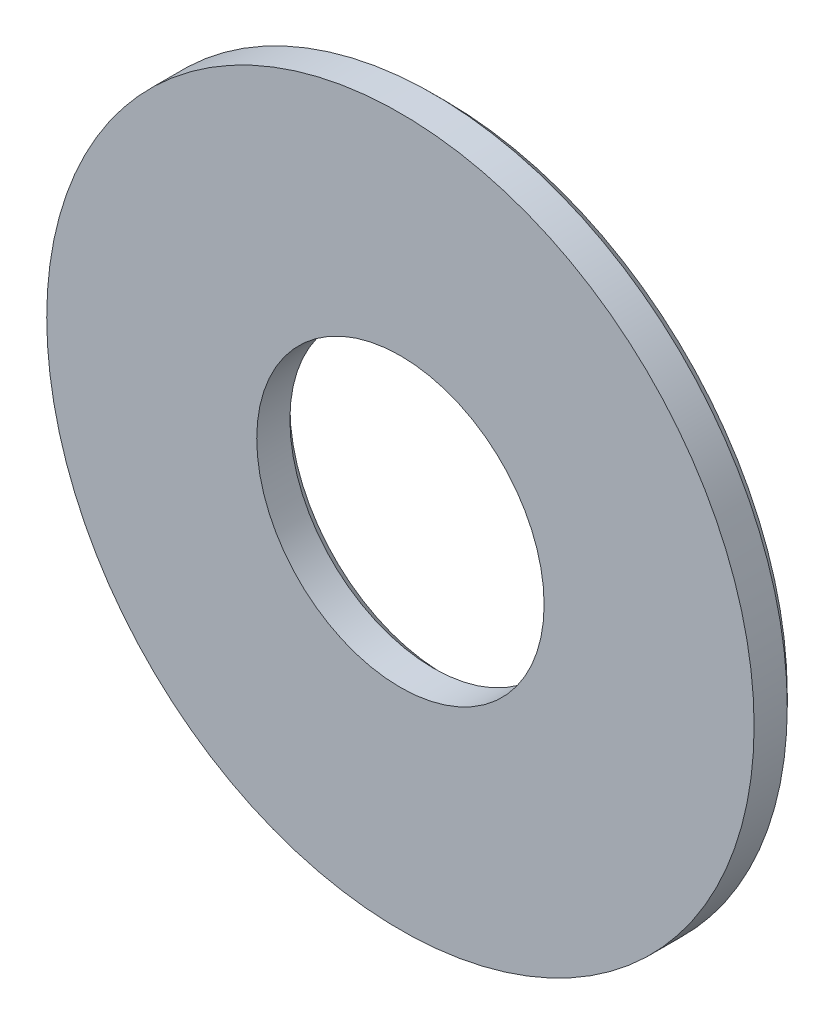
ISO-10303-21;
HEADER;
FILE_DESCRIPTION(('STEP AP214'),'2;1');
FILE_NAME('part.step','',(''),(''),'','','');
FILE_SCHEMA(('AUTOMOTIVE_DESIGN { 1 0 10303 214 1 1 1 1 }'));
ENDSEC;
DATA;
#1=APPLICATION_CONTEXT('core data for automotive mechanical design processes');
#2=APPLICATION_PROTOCOL_DEFINITION('international standard','automotive_design',2000,#1);
#3=PRODUCT_CONTEXT('',#1,'mechanical');
#4=PRODUCT('Part','Part','',(#3));
#5=PRODUCT_RELATED_PRODUCT_CATEGORY('part','',(#4));
#6=PRODUCT_DEFINITION_FORMATION('','',#4);
#7=PRODUCT_DEFINITION_CONTEXT('part definition',#1,'design');
#8=PRODUCT_DEFINITION('design','',#6,#7);
#9=PRODUCT_DEFINITION_SHAPE('','',#8);
#10=(LENGTH_UNIT() NAMED_UNIT(*) SI_UNIT(.MILLI.,.METRE.));
#11=(NAMED_UNIT(*) PLANE_ANGLE_UNIT() SI_UNIT($,.RADIAN.));
#12=(NAMED_UNIT(*) SI_UNIT($,.STERADIAN.) SOLID_ANGLE_UNIT());
#13=UNCERTAINTY_MEASURE_WITH_UNIT(LENGTH_MEASURE(1.E-05),#10,'distance_accuracy_value','');
#14=(GEOMETRIC_REPRESENTATION_CONTEXT(3) GLOBAL_UNCERTAINTY_ASSIGNED_CONTEXT((#13)) GLOBAL_UNIT_ASSIGNED_CONTEXT((#10,
#11,#12)) REPRESENTATION_CONTEXT('',''));
#15=CARTESIAN_POINT('',(0.,0.,0.));
#16=DIRECTION('',(0.,0.,1.));
#17=DIRECTION('',(1.,0.,0.));
#18=AXIS2_PLACEMENT_3D('',#15,#16,#17);
#19=CARTESIAN_POINT('',(0.,0.,1.));
#20=DIRECTION('',(0.,0.,1.));
#21=DIRECTION('',(1.,0.,0.));
#22=AXIS2_PLACEMENT_3D('',#19,#20,#21);
#23=PLANE('',#22);
#24=CARTESIAN_POINT('',(0.,0.,1.));
#25=DIRECTION('',(0.,0.,1.));
#26=DIRECTION('',(1.,0.,0.));
#27=AXIS2_PLACEMENT_3D('',#24,#25,#26);
#28=CIRCLE('',#27,8.);
#29=CARTESIAN_POINT('',(8.,0.,1.));
#30=VERTEX_POINT('',#29);
#31=EDGE_CURVE('E63',#30,#30,#28,.T.);
#32=ORIENTED_EDGE('',*,*,#31,.T.);
#33=EDGE_LOOP('',(#32));
#34=FACE_BOUND('',#33,.T.);
#35=CARTESIAN_POINT('',(0.,0.,1.));
#36=DIRECTION('',(0.,0.,1.));
#37=DIRECTION('',(1.,0.,0.));
#38=AXIS2_PLACEMENT_3D('',#35,#36,#37);
#39=CIRCLE('',#38,3.25);
#40=CARTESIAN_POINT('',(3.25,0.,1.));
#41=VERTEX_POINT('',#40);
#42=EDGE_CURVE('E67',#41,#41,#39,.T.);
#43=ORIENTED_EDGE('',*,*,#42,.F.);
#44=EDGE_LOOP('',(#43));
#45=FACE_BOUND('',#44,.T.);
#46=ADVANCED_FACE('F38',(#34,#45),#23,.T.);
#47=CARTESIAN_POINT('',(0.,0.,0.));
#48=DIRECTION('',(0.,0.,1.));
#49=DIRECTION('',(1.,0.,0.));
#50=AXIS2_PLACEMENT_3D('',#47,#48,#49);
#51=PLANE('',#50);
#52=CARTESIAN_POINT('',(0.,0.,0.));
#53=DIRECTION('',(0.,0.,1.));
#54=DIRECTION('',(1.,0.,0.));
#55=AXIS2_PLACEMENT_3D('',#52,#53,#54);
#56=CIRCLE('',#55,3.5);
#57=CARTESIAN_POINT('',(3.5,0.,0.));
#58=VERTEX_POINT('',#57);
#59=EDGE_CURVE('E52',#58,#58,#56,.T.);
#60=ORIENTED_EDGE('',*,*,#59,.T.);
#61=EDGE_LOOP('',(#60));
#62=FACE_BOUND('',#61,.T.);
#63=CARTESIAN_POINT('',(0.,0.,0.));
#64=DIRECTION('',(0.,0.,1.));
#65=DIRECTION('',(1.,0.,0.));
#66=AXIS2_PLACEMENT_3D('',#63,#64,#65);
#67=CIRCLE('',#66,7.75);
#68=CARTESIAN_POINT('',(7.75,0.,0.));
#69=VERTEX_POINT('',#68);
#70=EDGE_CURVE('E57',#69,#69,#67,.F.);
#71=ORIENTED_EDGE('',*,*,#70,.T.);
#72=EDGE_LOOP('',(#71));
#73=FACE_BOUND('',#72,.T.);
#74=ADVANCED_FACE('F75',(#62,#73),#51,.F.);
#75=CARTESIAN_POINT('',(0.,0.,1.));
#76=DIRECTION('',(0.,0.,-1.));
#77=DIRECTION('',(-1.,0.,0.));
#78=AXIS2_PLACEMENT_3D('',#75,#76,#77);
#79=CYLINDRICAL_SURFACE('',#78,8.);
#80=CARTESIAN_POINT('',(0.,0.,0.249999999999997));
#81=DIRECTION('',(0.,0.,1.));
#82=DIRECTION('',(1.,0.,0.));
#83=AXIS2_PLACEMENT_3D('',#80,#81,#82);
#84=CIRCLE('',#83,8.);
#85=CARTESIAN_POINT('',(8.,0.,0.249999999999997));
#86=VERTEX_POINT('',#85);
#87=EDGE_CURVE('E10',#86,#86,#84,.T.);
#88=ORIENTED_EDGE('',*,*,#87,.T.);
#89=EDGE_LOOP('',(#88));
#90=FACE_BOUND('',#89,.T.);
#91=ORIENTED_EDGE('',*,*,#31,.F.);
#92=EDGE_LOOP('',(#91));
#93=FACE_BOUND('',#92,.T.);
#94=ADVANCED_FACE('F82',(#90,#93),#79,.T.);
#95=CARTESIAN_POINT('',(0.,0.,1.));
#96=DIRECTION('',(0.,0.,-1.));
#97=DIRECTION('',(-1.,0.,0.));
#98=AXIS2_PLACEMENT_3D('',#95,#96,#97);
#99=CYLINDRICAL_SURFACE('',#98,3.25);
#100=CARTESIAN_POINT('',(0.,0.,0.25));
#101=DIRECTION('',(0.,0.,1.));
#102=DIRECTION('',(1.,0.,0.));
#103=AXIS2_PLACEMENT_3D('',#100,#101,#102);
#104=CIRCLE('',#103,3.25);
#105=CARTESIAN_POINT('',(3.25,0.,0.25));
#106=VERTEX_POINT('',#105);
#107=EDGE_CURVE('E47',#106,#106,#104,.F.);
#108=ORIENTED_EDGE('',*,*,#107,.T.);
#109=EDGE_LOOP('',(#108));
#110=FACE_BOUND('',#109,.T.);
#111=ORIENTED_EDGE('',*,*,#42,.T.);
#112=EDGE_LOOP('',(#111));
#113=FACE_BOUND('',#112,.T.);
#114=ADVANCED_FACE('F72',(#110,#113),#99,.F.);
#115=CARTESIAN_POINT('',(0.,0.,0.));
#116=DIRECTION('',(0.,0.,-1.));
#117=DIRECTION('',(-1.,0.,0.));
#118=AXIS2_PLACEMENT_3D('',#115,#116,#117);
#119=CONICAL_SURFACE('',#118,3.5,0.78539816339745);
#120=ORIENTED_EDGE('',*,*,#107,.F.);
#121=EDGE_LOOP('',(#120));
#122=FACE_BOUND('',#121,.T.);
#123=ORIENTED_EDGE('',*,*,#59,.F.);
#124=EDGE_LOOP('',(#123));
#125=FACE_BOUND('',#124,.T.);
#126=ADVANCED_FACE('F89',(#122,#125),#119,.F.);
#127=CARTESIAN_POINT('',(0.,0.,0.249999999999997));
#128=DIRECTION('',(0.,0.,1.));
#129=DIRECTION('',(1.,0.,0.));
#130=AXIS2_PLACEMENT_3D('',#127,#128,#129);
#131=CONICAL_SURFACE('',#130,8.,0.785398163397452);
#132=ORIENTED_EDGE('',*,*,#70,.F.);
#133=EDGE_LOOP('',(#132));
#134=FACE_BOUND('',#133,.T.);
#135=ORIENTED_EDGE('',*,*,#87,.F.);
#136=EDGE_LOOP('',(#135));
#137=FACE_BOUND('',#136,.T.);
#138=ADVANCED_FACE('F41',(#134,#137),#131,.T.);
#139=CLOSED_SHELL('',(#46,#74,#94,#114,#126,#138));
#140=MANIFOLD_SOLID_BREP('B2',#139);
#141=ADVANCED_BREP_SHAPE_REPRESENTATION('',(#18,#140),#14);
#142=SHAPE_DEFINITION_REPRESENTATION(#9,#141);
ENDSEC;
END-ISO-10303-21;
